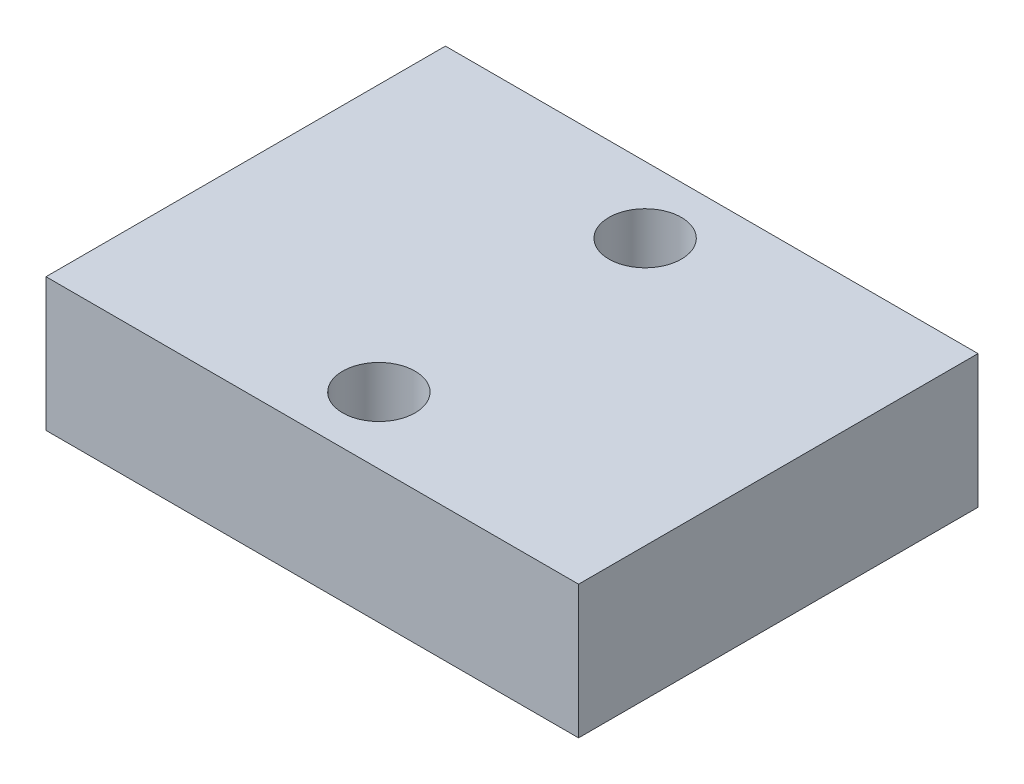
ISO-10303-21;
HEADER;
FILE_DESCRIPTION(('STEP AP214'),'2;1');
FILE_NAME('part.step','',(''),(''),'','','');
FILE_SCHEMA(('AUTOMOTIVE_DESIGN { 1 0 10303 214 1 1 1 1 }'));
ENDSEC;
DATA;
#1=APPLICATION_CONTEXT('core data for automotive mechanical design processes');
#2=APPLICATION_PROTOCOL_DEFINITION('international standard','automotive_design',2000,#1);
#3=PRODUCT_CONTEXT('',#1,'mechanical');
#4=PRODUCT('Part','Part','',(#3));
#5=PRODUCT_RELATED_PRODUCT_CATEGORY('part','',(#4));
#6=PRODUCT_DEFINITION_FORMATION('','',#4);
#7=PRODUCT_DEFINITION_CONTEXT('part definition',#1,'design');
#8=PRODUCT_DEFINITION('design','',#6,#7);
#9=PRODUCT_DEFINITION_SHAPE('','',#8);
#10=(LENGTH_UNIT() NAMED_UNIT(*) SI_UNIT(.MILLI.,.METRE.));
#11=(NAMED_UNIT(*) PLANE_ANGLE_UNIT() SI_UNIT($,.RADIAN.));
#12=(NAMED_UNIT(*) SI_UNIT($,.STERADIAN.) SOLID_ANGLE_UNIT());
#13=UNCERTAINTY_MEASURE_WITH_UNIT(LENGTH_MEASURE(1.E-05),#10,'distance_accuracy_value','');
#14=(GEOMETRIC_REPRESENTATION_CONTEXT(3) GLOBAL_UNCERTAINTY_ASSIGNED_CONTEXT((#13)) GLOBAL_UNIT_ASSIGNED_CONTEXT((#10,
#11,#12)) REPRESENTATION_CONTEXT('',''));
#15=CARTESIAN_POINT('',(0.,0.,0.));
#16=DIRECTION('',(0.,0.,1.));
#17=DIRECTION('',(1.,0.,0.));
#18=AXIS2_PLACEMENT_3D('',#15,#16,#17);
#19=CARTESIAN_POINT('',(12.7,3.175,-9.525));
#20=DIRECTION('',(-1.,0.,0.));
#21=DIRECTION('',(0.,0.,1.));
#22=AXIS2_PLACEMENT_3D('',#19,#20,#21);
#23=PLANE('',#22);
#24=DIRECTION('',(0.,0.,-1.));
#25=VECTOR('',#24,1.);
#26=CARTESIAN_POINT('',(12.7,-3.175,-9.525));
#27=LINE('',#26,#25);
#28=CARTESIAN_POINT('',(12.7,-3.175,9.525));
#29=VERTEX_POINT('',#28);
#30=CARTESIAN_POINT('',(12.7,-3.175,-9.525));
#31=VERTEX_POINT('',#30);
#32=EDGE_CURVE('E97',#29,#31,#27,.T.);
#33=ORIENTED_EDGE('',*,*,#32,.T.);
#34=DIRECTION('',(0.,-1.,0.));
#35=VECTOR('',#34,1.);
#36=CARTESIAN_POINT('',(12.7,3.175,-9.525));
#37=LINE('',#36,#35);
#38=CARTESIAN_POINT('',(12.7,3.175,-9.525));
#39=VERTEX_POINT('',#38);
#40=EDGE_CURVE('E11',#39,#31,#37,.T.);
#41=ORIENTED_EDGE('',*,*,#40,.F.);
#42=DIRECTION('',(0.,0.,-1.));
#43=VECTOR('',#42,1.);
#44=CARTESIAN_POINT('',(12.7,3.175,-9.525));
#45=LINE('',#44,#43);
#46=CARTESIAN_POINT('',(12.7,3.175,9.525));
#47=VERTEX_POINT('',#46);
#48=EDGE_CURVE('E85',#47,#39,#45,.T.);
#49=ORIENTED_EDGE('',*,*,#48,.F.);
#50=DIRECTION('',(0.,-1.,0.));
#51=VECTOR('',#50,1.);
#52=CARTESIAN_POINT('',(12.7,3.175,9.525));
#53=LINE('',#52,#51);
#54=EDGE_CURVE('E93',#47,#29,#53,.T.);
#55=ORIENTED_EDGE('',*,*,#54,.T.);
#56=EDGE_LOOP('',(#33,#41,#49,#55));
#57=FACE_BOUND('',#56,.T.);
#58=ADVANCED_FACE('F34',(#57),#23,.F.);
#59=CARTESIAN_POINT('',(-12.7,3.175,-9.525));
#60=DIRECTION('',(0.,0.,1.));
#61=DIRECTION('',(1.,0.,0.));
#62=AXIS2_PLACEMENT_3D('',#59,#60,#61);
#63=PLANE('',#62);
#64=DIRECTION('',(-1.,0.,0.));
#65=VECTOR('',#64,1.);
#66=CARTESIAN_POINT('',(-12.7,-3.175,-9.525));
#67=LINE('',#66,#65);
#68=CARTESIAN_POINT('',(-12.7,-3.175,-9.525));
#69=VERTEX_POINT('',#68);
#70=EDGE_CURVE('E89',#31,#69,#67,.T.);
#71=ORIENTED_EDGE('',*,*,#70,.T.);
#72=DIRECTION('',(0.,-1.,0.));
#73=VECTOR('',#72,1.);
#74=CARTESIAN_POINT('',(-12.7,3.175,-9.525));
#75=LINE('',#74,#73);
#76=CARTESIAN_POINT('',(-12.7,3.175,-9.525));
#77=VERTEX_POINT('',#76);
#78=EDGE_CURVE('E42',#77,#69,#75,.T.);
#79=ORIENTED_EDGE('',*,*,#78,.F.);
#80=DIRECTION('',(-1.,0.,0.));
#81=VECTOR('',#80,1.);
#82=CARTESIAN_POINT('',(-12.7,3.175,-9.525));
#83=LINE('',#82,#81);
#84=EDGE_CURVE('E80',#39,#77,#83,.T.);
#85=ORIENTED_EDGE('',*,*,#84,.F.);
#86=ORIENTED_EDGE('',*,*,#40,.T.);
#87=EDGE_LOOP('',(#71,#79,#85,#86));
#88=FACE_BOUND('',#87,.T.);
#89=ADVANCED_FACE('F88',(#88),#63,.F.);
#90=CARTESIAN_POINT('',(-12.7,3.175,-9.525));
#91=DIRECTION('',(1.,0.,0.));
#92=DIRECTION('',(0.,0.,-1.));
#93=AXIS2_PLACEMENT_3D('',#90,#91,#92);
#94=PLANE('',#93);
#95=DIRECTION('',(0.,0.,1.));
#96=VECTOR('',#95,1.);
#97=CARTESIAN_POINT('',(-12.7,-3.175,-9.525));
#98=LINE('',#97,#96);
#99=CARTESIAN_POINT('',(-12.7,-3.175,9.525));
#100=VERTEX_POINT('',#99);
#101=EDGE_CURVE('E67',#69,#100,#98,.T.);
#102=ORIENTED_EDGE('',*,*,#101,.T.);
#103=DIRECTION('',(0.,-1.,0.));
#104=VECTOR('',#103,1.);
#105=CARTESIAN_POINT('',(-12.7,3.175,9.525));
#106=LINE('',#105,#104);
#107=CARTESIAN_POINT('',(-12.7,3.175,9.525));
#108=VERTEX_POINT('',#107);
#109=EDGE_CURVE('E90',#108,#100,#106,.T.);
#110=ORIENTED_EDGE('',*,*,#109,.F.);
#111=DIRECTION('',(0.,0.,1.));
#112=VECTOR('',#111,1.);
#113=CARTESIAN_POINT('',(-12.7,3.175,-9.525));
#114=LINE('',#113,#112);
#115=EDGE_CURVE('E83',#77,#108,#114,.T.);
#116=ORIENTED_EDGE('',*,*,#115,.F.);
#117=ORIENTED_EDGE('',*,*,#78,.T.);
#118=EDGE_LOOP('',(#102,#110,#116,#117));
#119=FACE_BOUND('',#118,.T.);
#120=ADVANCED_FACE('F91',(#119),#94,.F.);
#121=CARTESIAN_POINT('',(-12.7,3.175,9.525));
#122=DIRECTION('',(0.,0.,-1.));
#123=DIRECTION('',(-1.,0.,0.));
#124=AXIS2_PLACEMENT_3D('',#121,#122,#123);
#125=PLANE('',#124);
#126=DIRECTION('',(1.,0.,0.));
#127=VECTOR('',#126,1.);
#128=CARTESIAN_POINT('',(-12.7,-3.175,9.525));
#129=LINE('',#128,#127);
#130=EDGE_CURVE('E73',#100,#29,#129,.T.);
#131=ORIENTED_EDGE('',*,*,#130,.T.);
#132=ORIENTED_EDGE('',*,*,#54,.F.);
#133=DIRECTION('',(1.,0.,0.));
#134=VECTOR('',#133,1.);
#135=CARTESIAN_POINT('',(-12.7,3.175,9.525));
#136=LINE('',#135,#134);
#137=EDGE_CURVE('E50',#108,#47,#136,.T.);
#138=ORIENTED_EDGE('',*,*,#137,.F.);
#139=ORIENTED_EDGE('',*,*,#109,.T.);
#140=EDGE_LOOP('',(#131,#132,#138,#139));
#141=FACE_BOUND('',#140,.T.);
#142=ADVANCED_FACE('F105',(#141),#125,.F.);
#143=CARTESIAN_POINT('',(0.,3.175,0.));
#144=DIRECTION('',(0.,1.,0.));
#145=DIRECTION('',(0.,0.,1.));
#146=AXIS2_PLACEMENT_3D('',#143,#144,#145);
#147=PLANE('',#146);
#148=CARTESIAN_POINT('',(0.,3.175,-6.35));
#149=DIRECTION('',(0.,1.,0.));
#150=DIRECTION('',(0.,0.,1.));
#151=AXIS2_PLACEMENT_3D('',#148,#149,#150);
#152=CIRCLE('',#151,1.72719999999999);
#153=CARTESIAN_POINT('',(0.,3.175,-4.62280000000001));
#154=VERTEX_POINT('',#153);
#155=EDGE_CURVE('E119',#154,#154,#152,.T.);
#156=ORIENTED_EDGE('',*,*,#155,.F.);
#157=EDGE_LOOP('',(#156));
#158=FACE_BOUND('',#157,.T.);
#159=CARTESIAN_POINT('',(0.,3.175,6.35));
#160=DIRECTION('',(0.,1.,0.));
#161=DIRECTION('',(0.,0.,1.));
#162=AXIS2_PLACEMENT_3D('',#159,#160,#161);
#163=CIRCLE('',#162,1.72719999999999);
#164=CARTESIAN_POINT('',(0.,3.175,8.07719999999999));
#165=VERTEX_POINT('',#164);
#166=EDGE_CURVE('E113',#165,#165,#163,.T.);
#167=ORIENTED_EDGE('',*,*,#166,.F.);
#168=EDGE_LOOP('',(#167));
#169=FACE_BOUND('',#168,.T.);
#170=ORIENTED_EDGE('',*,*,#48,.T.);
#171=ORIENTED_EDGE('',*,*,#84,.T.);
#172=ORIENTED_EDGE('',*,*,#115,.T.);
#173=ORIENTED_EDGE('',*,*,#137,.T.);
#174=EDGE_LOOP('',(#170,#171,#172,#173));
#175=FACE_BOUND('',#174,.T.);
#176=ADVANCED_FACE('F81',(#158,#169,#175),#147,.T.);
#177=CARTESIAN_POINT('',(0.,-3.175,0.));
#178=DIRECTION('',(0.,1.,0.));
#179=DIRECTION('',(0.,0.,1.));
#180=AXIS2_PLACEMENT_3D('',#177,#178,#179);
#181=PLANE('',#180);
#182=CARTESIAN_POINT('',(0.,-3.175,-6.35));
#183=DIRECTION('',(0.,1.,0.));
#184=DIRECTION('',(0.,0.,1.));
#185=AXIS2_PLACEMENT_3D('',#182,#183,#184);
#186=CIRCLE('',#185,1.72719999999999);
#187=CARTESIAN_POINT('',(0.,-3.175,-4.62280000000001));
#188=VERTEX_POINT('',#187);
#189=EDGE_CURVE('E116',#188,#188,#186,.T.);
#190=ORIENTED_EDGE('',*,*,#189,.T.);
#191=EDGE_LOOP('',(#190));
#192=FACE_BOUND('',#191,.T.);
#193=CARTESIAN_POINT('',(0.,-3.175,6.35));
#194=DIRECTION('',(0.,1.,0.));
#195=DIRECTION('',(0.,0.,1.));
#196=AXIS2_PLACEMENT_3D('',#193,#194,#195);
#197=CIRCLE('',#196,1.72719999999999);
#198=CARTESIAN_POINT('',(0.,-3.175,8.07719999999999));
#199=VERTEX_POINT('',#198);
#200=EDGE_CURVE('E100',#199,#199,#197,.T.);
#201=ORIENTED_EDGE('',*,*,#200,.T.);
#202=EDGE_LOOP('',(#201));
#203=FACE_BOUND('',#202,.T.);
#204=ORIENTED_EDGE('',*,*,#32,.F.);
#205=ORIENTED_EDGE('',*,*,#130,.F.);
#206=ORIENTED_EDGE('',*,*,#101,.F.);
#207=ORIENTED_EDGE('',*,*,#70,.F.);
#208=EDGE_LOOP('',(#204,#205,#206,#207));
#209=FACE_BOUND('',#208,.T.);
#210=ADVANCED_FACE('F108',(#192,#203,#209),#181,.F.);
#211=CARTESIAN_POINT('',(0.,3.175,6.35));
#212=DIRECTION('',(0.,1.,0.));
#213=DIRECTION('',(0.,0.,1.));
#214=AXIS2_PLACEMENT_3D('',#211,#212,#213);
#215=CYLINDRICAL_SURFACE('',#214,1.72719999999999);
#216=ORIENTED_EDGE('',*,*,#200,.F.);
#217=EDGE_LOOP('',(#216));
#218=FACE_BOUND('',#217,.T.);
#219=ORIENTED_EDGE('',*,*,#166,.T.);
#220=EDGE_LOOP('',(#219));
#221=FACE_BOUND('',#220,.T.);
#222=ADVANCED_FACE('F130',(#218,#221),#215,.F.);
#223=CARTESIAN_POINT('',(0.,3.175,-6.35));
#224=DIRECTION('',(0.,1.,0.));
#225=DIRECTION('',(0.,0.,1.));
#226=AXIS2_PLACEMENT_3D('',#223,#224,#225);
#227=CYLINDRICAL_SURFACE('',#226,1.72719999999999);
#228=ORIENTED_EDGE('',*,*,#189,.F.);
#229=EDGE_LOOP('',(#228));
#230=FACE_BOUND('',#229,.T.);
#231=ORIENTED_EDGE('',*,*,#155,.T.);
#232=EDGE_LOOP('',(#231));
#233=FACE_BOUND('',#232,.T.);
#234=ADVANCED_FACE('F123',(#230,#233),#227,.F.);
#235=CLOSED_SHELL('',(#58,#89,#120,#142,#176,#210,#222,#234));
#236=MANIFOLD_SOLID_BREP('B2',#235);
#237=ADVANCED_BREP_SHAPE_REPRESENTATION('',(#18,#236),#14);
#238=SHAPE_DEFINITION_REPRESENTATION(#9,#237);
ENDSEC;
END-ISO-10303-21;
